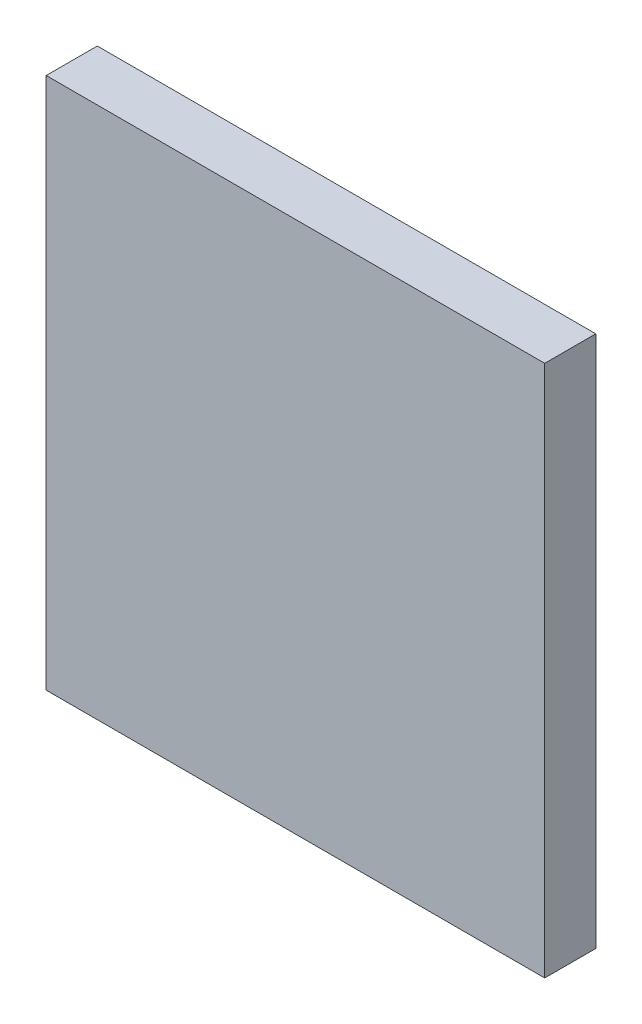
ISO-10303-21;
HEADER;
FILE_DESCRIPTION(('STEP AP214'),'2;1');
FILE_NAME('part.step','',(''),(''),'','','');
FILE_SCHEMA(('AUTOMOTIVE_DESIGN { 1 0 10303 214 1 1 1 1 }'));
ENDSEC;
DATA;
#1=APPLICATION_CONTEXT('core data for automotive mechanical design processes');
#2=APPLICATION_PROTOCOL_DEFINITION('international standard','automotive_design',2000,#1);
#3=PRODUCT_CONTEXT('',#1,'mechanical');
#4=PRODUCT('Part','Part','',(#3));
#5=PRODUCT_RELATED_PRODUCT_CATEGORY('part','',(#4));
#6=PRODUCT_DEFINITION_FORMATION('','',#4);
#7=PRODUCT_DEFINITION_CONTEXT('part definition',#1,'design');
#8=PRODUCT_DEFINITION('design','',#6,#7);
#9=PRODUCT_DEFINITION_SHAPE('','',#8);
#10=(LENGTH_UNIT() NAMED_UNIT(*) SI_UNIT(.MILLI.,.METRE.));
#11=(NAMED_UNIT(*) PLANE_ANGLE_UNIT() SI_UNIT($,.RADIAN.));
#12=(NAMED_UNIT(*) SI_UNIT($,.STERADIAN.) SOLID_ANGLE_UNIT());
#13=UNCERTAINTY_MEASURE_WITH_UNIT(LENGTH_MEASURE(1.E-05),#10,'distance_accuracy_value','');
#14=(GEOMETRIC_REPRESENTATION_CONTEXT(3) GLOBAL_UNCERTAINTY_ASSIGNED_CONTEXT((#13)) GLOBAL_UNIT_ASSIGNED_CONTEXT((#10,
#11,#12)) REPRESENTATION_CONTEXT('',''));
#15=CARTESIAN_POINT('',(0.,0.,0.));
#16=DIRECTION('',(0.,0.,1.));
#17=DIRECTION('',(1.,0.,0.));
#18=AXIS2_PLACEMENT_3D('',#15,#16,#17);
#19=CARTESIAN_POINT('',(0.,-52.9194635306554,10.));
#20=DIRECTION('',(0.,1.,0.));
#21=DIRECTION('',(0.,0.,1.));
#22=AXIS2_PLACEMENT_3D('',#19,#20,#21);
#23=PLANE('',#22);
#24=DIRECTION('',(1.,0.,0.));
#25=VECTOR('',#24,1.);
#26=CARTESIAN_POINT('',(0.,-52.9194635306554,0.));
#27=LINE('',#26,#25);
#28=CARTESIAN_POINT('',(91.5861916448773,-52.9194635306554,0.));
#29=VERTEX_POINT('',#28);
#30=CARTESIAN_POINT('',(189.190655973086,-52.9194635306554,0.));
#31=VERTEX_POINT('',#30);
#32=EDGE_CURVE('E97',#29,#31,#27,.T.);
#33=ORIENTED_EDGE('',*,*,#32,.T.);
#34=DIRECTION('',(0.,0.,-1.));
#35=VECTOR('',#34,1.);
#36=CARTESIAN_POINT('',(189.190655973086,-52.9194635306554,10.));
#37=LINE('',#36,#35);
#38=CARTESIAN_POINT('',(189.190655973086,-52.9194635306554,10.));
#39=VERTEX_POINT('',#38);
#40=EDGE_CURVE('E11',#39,#31,#37,.T.);
#41=ORIENTED_EDGE('',*,*,#40,.F.);
#42=DIRECTION('',(1.,0.,0.));
#43=VECTOR('',#42,1.);
#44=CARTESIAN_POINT('',(0.,-52.9194635306554,10.));
#45=LINE('',#44,#43);
#46=CARTESIAN_POINT('',(91.5861916448773,-52.9194635306554,10.));
#47=VERTEX_POINT('',#46);
#48=EDGE_CURVE('E74',#47,#39,#45,.T.);
#49=ORIENTED_EDGE('',*,*,#48,.F.);
#50=DIRECTION('',(0.,0.,-1.));
#51=VECTOR('',#50,1.);
#52=CARTESIAN_POINT('',(91.5861916448773,-52.9194635306554,10.));
#53=LINE('',#52,#51);
#54=EDGE_CURVE('E93',#47,#29,#53,.T.);
#55=ORIENTED_EDGE('',*,*,#54,.T.);
#56=EDGE_LOOP('',(#33,#41,#49,#55));
#57=FACE_BOUND('',#56,.T.);
#58=ADVANCED_FACE('F35',(#57),#23,.F.);
#59=CARTESIAN_POINT('',(189.190655973086,0.,10.));
#60=DIRECTION('',(1.,0.,0.));
#61=DIRECTION('',(0.,0.,-1.));
#62=AXIS2_PLACEMENT_3D('',#59,#60,#61);
#63=PLANE('',#62);
#64=DIRECTION('',(0.,-1.,0.));
#65=VECTOR('',#64,1.);
#66=CARTESIAN_POINT('',(189.190655973086,0.,0.));
#67=LINE('',#66,#65);
#68=CARTESIAN_POINT('',(189.190655973086,51.3117836259266,0.));
#69=VERTEX_POINT('',#68);
#70=EDGE_CURVE('E83',#69,#31,#67,.T.);
#71=ORIENTED_EDGE('',*,*,#70,.F.);
#72=DIRECTION('',(0.,0.,-1.));
#73=VECTOR('',#72,1.);
#74=CARTESIAN_POINT('',(189.190655973086,51.3117836259266,10.));
#75=LINE('',#74,#73);
#76=CARTESIAN_POINT('',(189.190655973086,51.3117836259266,10.));
#77=VERTEX_POINT('',#76);
#78=EDGE_CURVE('E43',#77,#69,#75,.T.);
#79=ORIENTED_EDGE('',*,*,#78,.F.);
#80=DIRECTION('',(0.,-1.,0.));
#81=VECTOR('',#80,1.);
#82=CARTESIAN_POINT('',(189.190655973086,0.,10.));
#83=LINE('',#82,#81);
#84=EDGE_CURVE('E81',#77,#39,#83,.T.);
#85=ORIENTED_EDGE('',*,*,#84,.T.);
#86=ORIENTED_EDGE('',*,*,#40,.T.);
#87=EDGE_LOOP('',(#71,#79,#85,#86));
#88=FACE_BOUND('',#87,.T.);
#89=ADVANCED_FACE('F80',(#88),#63,.T.);
#90=CARTESIAN_POINT('',(0.,51.3117836259266,10.));
#91=DIRECTION('',(0.,1.,0.));
#92=DIRECTION('',(0.,0.,1.));
#93=AXIS2_PLACEMENT_3D('',#90,#91,#92);
#94=PLANE('',#93);
#95=DIRECTION('',(1.,0.,0.));
#96=VECTOR('',#95,1.);
#97=CARTESIAN_POINT('',(0.,51.3117836259266,0.));
#98=LINE('',#97,#96);
#99=CARTESIAN_POINT('',(91.5861916448773,51.3117836259266,0.));
#100=VERTEX_POINT('',#99);
#101=EDGE_CURVE('E101',#100,#69,#98,.T.);
#102=ORIENTED_EDGE('',*,*,#101,.F.);
#103=DIRECTION('',(0.,0.,-1.));
#104=VECTOR('',#103,1.);
#105=CARTESIAN_POINT('',(91.5861916448773,51.3117836259266,10.));
#106=LINE('',#105,#104);
#107=CARTESIAN_POINT('',(91.5861916448773,51.3117836259266,10.));
#108=VERTEX_POINT('',#107);
#109=EDGE_CURVE('E66',#108,#100,#106,.T.);
#110=ORIENTED_EDGE('',*,*,#109,.F.);
#111=DIRECTION('',(1.,0.,0.));
#112=VECTOR('',#111,1.);
#113=CARTESIAN_POINT('',(0.,51.3117836259266,10.));
#114=LINE('',#113,#112);
#115=EDGE_CURVE('E89',#108,#77,#114,.T.);
#116=ORIENTED_EDGE('',*,*,#115,.T.);
#117=ORIENTED_EDGE('',*,*,#78,.T.);
#118=EDGE_LOOP('',(#102,#110,#116,#117));
#119=FACE_BOUND('',#118,.T.);
#120=ADVANCED_FACE('F91',(#119),#94,.T.);
#121=CARTESIAN_POINT('',(91.5861916448773,0.,10.));
#122=DIRECTION('',(1.,0.,0.));
#123=DIRECTION('',(0.,0.,-1.));
#124=AXIS2_PLACEMENT_3D('',#121,#122,#123);
#125=PLANE('',#124);
#126=DIRECTION('',(0.,-1.,0.));
#127=VECTOR('',#126,1.);
#128=CARTESIAN_POINT('',(91.5861916448773,0.,0.));
#129=LINE('',#128,#127);
#130=EDGE_CURVE('E69',#100,#29,#129,.T.);
#131=ORIENTED_EDGE('',*,*,#130,.T.);
#132=ORIENTED_EDGE('',*,*,#54,.F.);
#133=DIRECTION('',(0.,-1.,0.));
#134=VECTOR('',#133,1.);
#135=CARTESIAN_POINT('',(91.5861916448773,0.,10.));
#136=LINE('',#135,#134);
#137=EDGE_CURVE('E51',#108,#47,#136,.T.);
#138=ORIENTED_EDGE('',*,*,#137,.F.);
#139=ORIENTED_EDGE('',*,*,#109,.T.);
#140=EDGE_LOOP('',(#131,#132,#138,#139));
#141=FACE_BOUND('',#140,.T.);
#142=ADVANCED_FACE('F114',(#141),#125,.F.);
#143=CARTESIAN_POINT('',(0.,0.,10.));
#144=DIRECTION('',(0.,0.,1.));
#145=DIRECTION('',(1.,0.,0.));
#146=AXIS2_PLACEMENT_3D('',#143,#144,#145);
#147=PLANE('',#146);
#148=ORIENTED_EDGE('',*,*,#48,.T.);
#149=ORIENTED_EDGE('',*,*,#84,.F.);
#150=ORIENTED_EDGE('',*,*,#115,.F.);
#151=ORIENTED_EDGE('',*,*,#137,.T.);
#152=EDGE_LOOP('',(#148,#149,#150,#151));
#153=FACE_BOUND('',#152,.T.);
#154=ADVANCED_FACE('F88',(#153),#147,.T.);
#155=CARTESIAN_POINT('',(0.,0.,0.));
#156=DIRECTION('',(0.,0.,1.));
#157=DIRECTION('',(1.,0.,0.));
#158=AXIS2_PLACEMENT_3D('',#155,#156,#157);
#159=PLANE('',#158);
#160=ORIENTED_EDGE('',*,*,#32,.F.);
#161=ORIENTED_EDGE('',*,*,#130,.F.);
#162=ORIENTED_EDGE('',*,*,#101,.T.);
#163=ORIENTED_EDGE('',*,*,#70,.T.);
#164=EDGE_LOOP('',(#160,#161,#162,#163));
#165=FACE_BOUND('',#164,.T.);
#166=ADVANCED_FACE('F108',(#165),#159,.F.);
#167=CLOSED_SHELL('',(#58,#89,#120,#142,#154,#166));
#168=MANIFOLD_SOLID_BREP('B2',#167);
#169=ADVANCED_BREP_SHAPE_REPRESENTATION('',(#18,#168),#14);
#170=SHAPE_DEFINITION_REPRESENTATION(#9,#169);
ENDSEC;
END-ISO-10303-21;
